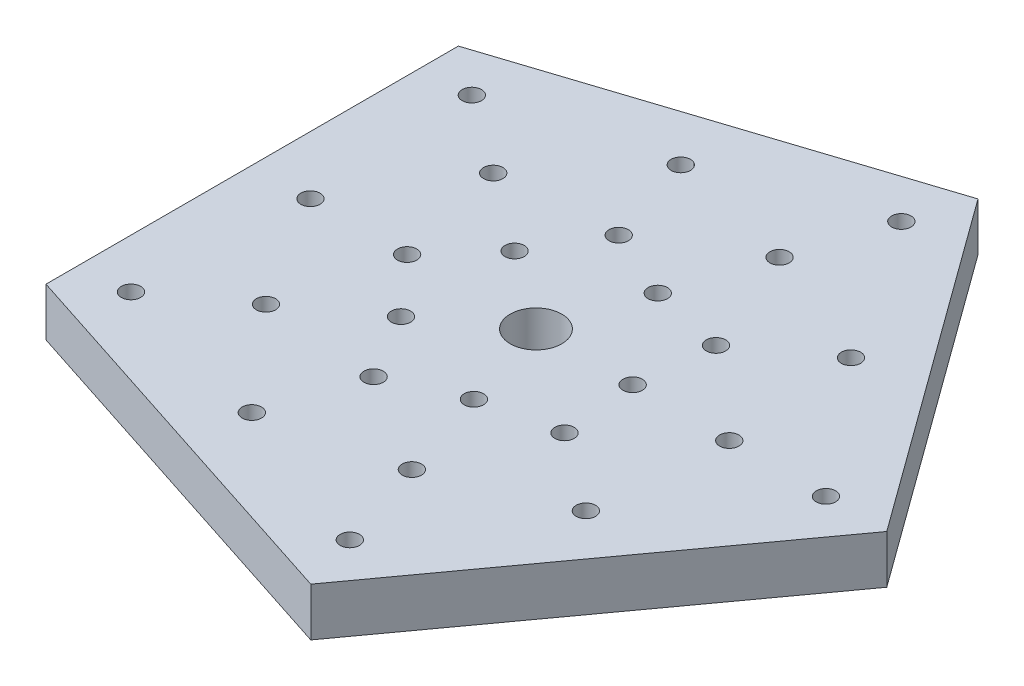
ISO-10303-21;
HEADER;
FILE_DESCRIPTION(('STEP AP214'),'2;1');
FILE_NAME('part.step','',(''),(''),'','','');
FILE_SCHEMA(('AUTOMOTIVE_DESIGN { 1 0 10303 214 1 1 1 1 }'));
ENDSEC;
DATA;
#1=APPLICATION_CONTEXT('core data for automotive mechanical design processes');
#2=APPLICATION_PROTOCOL_DEFINITION('international standard','automotive_design',2000,#1);
#3=PRODUCT_CONTEXT('',#1,'mechanical');
#4=PRODUCT('Part','Part','',(#3));
#5=PRODUCT_RELATED_PRODUCT_CATEGORY('part','',(#4));
#6=PRODUCT_DEFINITION_FORMATION('','',#4);
#7=PRODUCT_DEFINITION_CONTEXT('part definition',#1,'design');
#8=PRODUCT_DEFINITION('design','',#6,#7);
#9=PRODUCT_DEFINITION_SHAPE('','',#8);
#10=(LENGTH_UNIT() NAMED_UNIT(*) SI_UNIT(.MILLI.,.METRE.));
#11=(NAMED_UNIT(*) PLANE_ANGLE_UNIT() SI_UNIT($,.RADIAN.));
#12=(NAMED_UNIT(*) SI_UNIT($,.STERADIAN.) SOLID_ANGLE_UNIT());
#13=UNCERTAINTY_MEASURE_WITH_UNIT(LENGTH_MEASURE(1.E-05),#10,'distance_accuracy_value','');
#14=(GEOMETRIC_REPRESENTATION_CONTEXT(3) GLOBAL_UNCERTAINTY_ASSIGNED_CONTEXT((#13)) GLOBAL_UNIT_ASSIGNED_CONTEXT((#10,
#11,#12)) REPRESENTATION_CONTEXT('',''));
#15=CARTESIAN_POINT('',(0.,0.,0.));
#16=DIRECTION('',(0.,0.,1.));
#17=DIRECTION('',(1.,0.,0.));
#18=AXIS2_PLACEMENT_3D('',#15,#16,#17);
#19=CARTESIAN_POINT('',(16.8233955878123,7.5,51.7770876399966));
#20=DIRECTION('',(-0.809016994374947,0.,-0.587785252292473));
#21=DIRECTION('',(-0.587785252292473,0.,0.809016994374948));
#22=AXIS2_PLACEMENT_3D('',#19,#20,#21);
#23=PLANE('',#22);
#24=DIRECTION('',(0.587785252292473,0.,-0.809016994374948));
#25=VECTOR('',#24,1.);
#26=CARTESIAN_POINT('',(16.8233955878123,0.,51.7770876399966));
#27=LINE('',#26,#25);
#28=CARTESIAN_POINT('',(16.8233955878123,0.,51.7770876399966));
#29=VERTEX_POINT('',#28);
#30=CARTESIAN_POINT('',(54.4416517345306,0.,0.));
#31=VERTEX_POINT('',#30);
#32=EDGE_CURVE('E109',#29,#31,#27,.T.);
#33=ORIENTED_EDGE('',*,*,#32,.T.);
#34=DIRECTION('',(0.,-1.,0.));
#35=VECTOR('',#34,1.);
#36=CARTESIAN_POINT('',(54.4416517345306,7.5,0.));
#37=LINE('',#36,#35);
#38=CARTESIAN_POINT('',(54.4416517345306,7.5,0.));
#39=VERTEX_POINT('',#38);
#40=EDGE_CURVE('E11',#39,#31,#37,.T.);
#41=ORIENTED_EDGE('',*,*,#40,.F.);
#42=DIRECTION('',(0.587785252292473,0.,-0.809016994374948));
#43=VECTOR('',#42,1.);
#44=CARTESIAN_POINT('',(16.8233955878123,7.5,51.7770876399966));
#45=LINE('',#44,#43);
#46=CARTESIAN_POINT('',(16.8233955878123,7.5,51.7770876399966));
#47=VERTEX_POINT('',#46);
#48=EDGE_CURVE('E118',#47,#39,#45,.T.);
#49=ORIENTED_EDGE('',*,*,#48,.F.);
#50=DIRECTION('',(0.,-1.,0.));
#51=VECTOR('',#50,1.);
#52=CARTESIAN_POINT('',(16.8233955878123,7.5,51.7770876399966));
#53=LINE('',#52,#51);
#54=EDGE_CURVE('E105',#47,#29,#53,.T.);
#55=ORIENTED_EDGE('',*,*,#54,.T.);
#56=EDGE_LOOP('',(#33,#41,#49,#55));
#57=FACE_BOUND('',#56,.T.);
#58=ADVANCED_FACE('F35',(#57),#23,.F.);
#59=CARTESIAN_POINT('',(54.4416517345306,7.5,0.));
#60=DIRECTION('',(-0.809016994374947,0.,0.587785252292473));
#61=DIRECTION('',(0.587785252292473,0.,0.809016994374947));
#62=AXIS2_PLACEMENT_3D('',#59,#60,#61);
#63=PLANE('',#62);
#64=DIRECTION('',(-0.587785252292473,0.,-0.809016994374947));
#65=VECTOR('',#64,1.);
#66=CARTESIAN_POINT('',(54.4416517345306,0.,0.));
#67=LINE('',#66,#65);
#68=CARTESIAN_POINT('',(16.8233955878123,0.,-51.7770876399967));
#69=VERTEX_POINT('',#68);
#70=EDGE_CURVE('E112',#31,#69,#67,.T.);
#71=ORIENTED_EDGE('',*,*,#70,.T.);
#72=DIRECTION('',(0.,-1.,0.));
#73=VECTOR('',#72,1.);
#74=CARTESIAN_POINT('',(16.8233955878123,7.5,-51.7770876399967));
#75=LINE('',#74,#73);
#76=CARTESIAN_POINT('',(16.8233955878123,7.5,-51.7770876399967));
#77=VERTEX_POINT('',#76);
#78=EDGE_CURVE('E43',#77,#69,#75,.T.);
#79=ORIENTED_EDGE('',*,*,#78,.F.);
#80=DIRECTION('',(-0.587785252292473,0.,-0.809016994374947));
#81=VECTOR('',#80,1.);
#82=CARTESIAN_POINT('',(54.4416517345306,7.5,0.));
#83=LINE('',#82,#81);
#84=EDGE_CURVE('E85',#39,#77,#83,.T.);
#85=ORIENTED_EDGE('',*,*,#84,.F.);
#86=ORIENTED_EDGE('',*,*,#40,.T.);
#87=EDGE_LOOP('',(#71,#79,#85,#86));
#88=FACE_BOUND('',#87,.T.);
#89=ADVANCED_FACE('F138',(#88),#63,.F.);
#90=CARTESIAN_POINT('',(16.8233955878123,7.5,-51.7770876399967));
#91=DIRECTION('',(0.309016994374948,0.,0.951056516295154));
#92=DIRECTION('',(0.951056516295154,0.,-0.309016994374948));
#93=AXIS2_PLACEMENT_3D('',#90,#91,#92);
#94=PLANE('',#93);
#95=DIRECTION('',(-0.951056516295154,0.,0.309016994374948));
#96=VECTOR('',#95,1.);
#97=CARTESIAN_POINT('',(16.8233955878123,0.,-51.7770876399967));
#98=LINE('',#97,#96);
#99=CARTESIAN_POINT('',(-44.0442214550775,0.,-32.));
#100=VERTEX_POINT('',#99);
#101=EDGE_CURVE('E100',#69,#100,#98,.T.);
#102=ORIENTED_EDGE('',*,*,#101,.T.);
#103=DIRECTION('',(0.,-1.,0.));
#104=VECTOR('',#103,1.);
#105=CARTESIAN_POINT('',(-44.0442214550775,7.5,-32.));
#106=LINE('',#105,#104);
#107=CARTESIAN_POINT('',(-44.0442214550775,7.5,-32.));
#108=VERTEX_POINT('',#107);
#109=EDGE_CURVE('E97',#108,#100,#106,.T.);
#110=ORIENTED_EDGE('',*,*,#109,.F.);
#111=DIRECTION('',(-0.951056516295154,0.,0.309016994374948));
#112=VECTOR('',#111,1.);
#113=CARTESIAN_POINT('',(16.8233955878123,7.5,-51.7770876399967));
#114=LINE('',#113,#112);
#115=EDGE_CURVE('E89',#77,#108,#114,.T.);
#116=ORIENTED_EDGE('',*,*,#115,.F.);
#117=ORIENTED_EDGE('',*,*,#78,.T.);
#118=EDGE_LOOP('',(#102,#110,#116,#117));
#119=FACE_BOUND('',#118,.T.);
#120=ADVANCED_FACE('F98',(#119),#94,.F.);
#121=CARTESIAN_POINT('',(-44.0442214550775,7.5,-32.));
#122=DIRECTION('',(1.,0.,0.));
#123=DIRECTION('',(0.,0.,-1.));
#124=AXIS2_PLACEMENT_3D('',#121,#122,#123);
#125=PLANE('',#124);
#126=DIRECTION('',(0.,0.,1.));
#127=VECTOR('',#126,1.);
#128=CARTESIAN_POINT('',(-44.0442214550775,0.,-32.));
#129=LINE('',#128,#127);
#130=CARTESIAN_POINT('',(-44.0442214550775,0.,32.));
#131=VERTEX_POINT('',#130);
#132=EDGE_CURVE('E71',#100,#131,#129,.T.);
#133=ORIENTED_EDGE('',*,*,#132,.T.);
#134=DIRECTION('',(0.,-1.,0.));
#135=VECTOR('',#134,1.);
#136=CARTESIAN_POINT('',(-44.0442214550775,7.5,32.));
#137=LINE('',#136,#135);
#138=CARTESIAN_POINT('',(-44.0442214550775,7.5,32.));
#139=VERTEX_POINT('',#138);
#140=EDGE_CURVE('E101',#139,#131,#137,.T.);
#141=ORIENTED_EDGE('',*,*,#140,.F.);
#142=DIRECTION('',(0.,0.,1.));
#143=VECTOR('',#142,1.);
#144=CARTESIAN_POINT('',(-44.0442214550775,7.5,-32.));
#145=LINE('',#144,#143);
#146=EDGE_CURVE('E93',#108,#139,#145,.T.);
#147=ORIENTED_EDGE('',*,*,#146,.F.);
#148=ORIENTED_EDGE('',*,*,#109,.T.);
#149=EDGE_LOOP('',(#133,#141,#147,#148));
#150=FACE_BOUND('',#149,.T.);
#151=ADVANCED_FACE('F103',(#150),#125,.F.);
#152=CARTESIAN_POINT('',(-44.0442214550775,7.5,32.));
#153=DIRECTION('',(0.309016994374948,0.,-0.951056516295154));
#154=DIRECTION('',(-0.951056516295154,0.,-0.309016994374948));
#155=AXIS2_PLACEMENT_3D('',#152,#153,#154);
#156=PLANE('',#155);
#157=DIRECTION('',(0.951056516295154,0.,0.309016994374948));
#158=VECTOR('',#157,1.);
#159=CARTESIAN_POINT('',(-44.0442214550775,0.,32.));
#160=LINE('',#159,#158);
#161=EDGE_CURVE('E77',#131,#29,#160,.T.);
#162=ORIENTED_EDGE('',*,*,#161,.T.);
#163=ORIENTED_EDGE('',*,*,#54,.F.);
#164=DIRECTION('',(0.951056516295154,0.,0.309016994374948));
#165=VECTOR('',#164,1.);
#166=CARTESIAN_POINT('',(-44.0442214550775,7.5,32.));
#167=LINE('',#166,#165);
#168=EDGE_CURVE('E51',#139,#47,#167,.T.);
#169=ORIENTED_EDGE('',*,*,#168,.F.);
#170=ORIENTED_EDGE('',*,*,#140,.T.);
#171=EDGE_LOOP('',(#162,#163,#169,#170));
#172=FACE_BOUND('',#171,.T.);
#173=ADVANCED_FACE('F126',(#172),#156,.F.);
#174=CARTESIAN_POINT('',(0.,7.5,0.));
#175=DIRECTION('',(0.,1.,0.));
#176=DIRECTION('',(0.,0.,1.));
#177=AXIS2_PLACEMENT_3D('',#174,#175,#176);
#178=PLANE('',#177);
#179=CARTESIAN_POINT('',(15.,7.5,-1.75207071073658E-13));
#180=DIRECTION('',(0.,1.,0.));
#181=DIRECTION('',(-0.95105651629515,0.,0.309016994374958));
#182=AXIS2_PLACEMENT_3D('',#179,#180,#181);
#183=CIRCLE('',#182,1.5);
#184=CARTESIAN_POINT('',(13.5734152255573,7.5,0.463525491562262));
#185=VERTEX_POINT('',#184);
#186=EDGE_CURVE('E442',#185,#185,#183,.T.);
#187=ORIENTED_EDGE('',*,*,#186,.F.);
#188=EDGE_LOOP('',(#187));
#189=FACE_BOUND('',#188,.T.);
#190=CARTESIAN_POINT('',(30.,7.5,-3.46944695195361E-13));
#191=DIRECTION('',(0.,1.,0.));
#192=DIRECTION('',(-0.95105651629515,0.,0.309016994374958));
#193=AXIS2_PLACEMENT_3D('',#190,#191,#192);
#194=CIRCLE('',#193,1.5);
#195=CARTESIAN_POINT('',(28.5734152255573,7.5,0.463525491562091));
#196=VERTEX_POINT('',#195);
#197=EDGE_CURVE('E448',#196,#196,#194,.T.);
#198=ORIENTED_EDGE('',*,*,#197,.F.);
#199=EDGE_LOOP('',(#198));
#200=FACE_BOUND('',#199,.T.);
#201=CARTESIAN_POINT('',(45.,7.5,-5.20417042793042E-13));
#202=DIRECTION('',(0.,1.,0.));
#203=DIRECTION('',(-0.95105651629515,0.,0.309016994374958));
#204=AXIS2_PLACEMENT_3D('',#201,#202,#203);
#205=CIRCLE('',#204,1.5);
#206=CARTESIAN_POINT('',(43.5734152255573,7.5,0.463525491561918));
#207=VERTEX_POINT('',#206);
#208=EDGE_CURVE('E709',#207,#207,#205,.T.);
#209=ORIENTED_EDGE('',*,*,#208,.F.);
#210=EDGE_LOOP('',(#209));
#211=FACE_BOUND('',#210,.T.);
#212=CARTESIAN_POINT('',(-35.,7.5,4.02455846426619E-13));
#213=DIRECTION('',(0.,1.,0.));
#214=DIRECTION('',(-0.95105651629515,0.,0.309016994374958));
#215=AXIS2_PLACEMENT_3D('',#212,#213,#214);
#216=CIRCLE('',#215,1.5);
#217=CARTESIAN_POINT('',(-36.4265847744427,7.5,0.463525491562841));
#218=VERTEX_POINT('',#217);
#219=EDGE_CURVE('E445',#218,#218,#216,.T.);
#220=ORIENTED_EDGE('',*,*,#219,.F.);
#221=EDGE_LOOP('',(#220));
#222=FACE_BOUND('',#221,.T.);
#223=CARTESIAN_POINT('',(-20.,7.5,2.28983498828939E-13));
#224=DIRECTION('',(0.,1.,0.));
#225=DIRECTION('',(-0.95105651629515,0.,0.309016994374958));
#226=AXIS2_PLACEMENT_3D('',#223,#224,#225);
#227=CIRCLE('',#226,1.5);
#228=CARTESIAN_POINT('',(-21.4265847744427,7.5,0.463525491562667));
#229=VERTEX_POINT('',#228);
#230=EDGE_CURVE('E465',#229,#229,#227,.T.);
#231=ORIENTED_EDGE('',*,*,#230,.F.);
#232=EDGE_LOOP('',(#231));
#233=FACE_BOUND('',#232,.T.);
#234=CARTESIAN_POINT('',(13.905764746873,7.5,42.7975432332818));
#235=DIRECTION('',(0.,1.,0.));
#236=DIRECTION('',(-0.58778525229248,0.,-0.809016994374942));
#237=AXIS2_PLACEMENT_3D('',#234,#235,#236);
#238=CIRCLE('',#237,1.5);
#239=CARTESIAN_POINT('',(13.0240868684343,7.5,41.5840177417194));
#240=VERTEX_POINT('',#239);
#241=EDGE_CURVE('E459',#240,#240,#238,.T.);
#242=ORIENTED_EDGE('',*,*,#241,.F.);
#243=EDGE_LOOP('',(#242));
#244=FACE_BOUND('',#243,.T.);
#245=CARTESIAN_POINT('',(28.3155948031231,7.5,-20.5724838302367));
#246=DIRECTION('',(0.,1.,0.));
#247=DIRECTION('',(0.587785252292469,0.,-0.809016994374951));
#248=AXIS2_PLACEMENT_3D('',#245,#246,#247);
#249=CIRCLE('',#248,1.5);
#250=CARTESIAN_POINT('',(29.1972726815618,7.5,-21.7860093217992));
#251=VERTEX_POINT('',#250);
#252=EDGE_CURVE('E506',#251,#251,#249,.T.);
#253=ORIENTED_EDGE('',*,*,#252,.F.);
#254=EDGE_LOOP('',(#253));
#255=FACE_BOUND('',#254,.T.);
#256=CARTESIAN_POINT('',(16.1803398874989,7.5,-11.7557050458496));
#257=DIRECTION('',(0.,1.,0.));
#258=DIRECTION('',(0.587785252292469,0.,-0.809016994374951));
#259=AXIS2_PLACEMENT_3D('',#256,#257,#258);
#260=CIRCLE('',#259,1.5);
#261=CARTESIAN_POINT('',(17.0620177659376,7.5,-12.969230537412));
#262=VERTEX_POINT('',#261);
#263=EDGE_CURVE('E525',#262,#262,#260,.T.);
#264=ORIENTED_EDGE('',*,*,#263,.F.);
#265=EDGE_LOOP('',(#264));
#266=FACE_BOUND('',#265,.T.);
#267=CARTESIAN_POINT('',(-36.4057647468727,7.5,-26.4503363531612));
#268=DIRECTION('',(0.,1.,0.));
#269=DIRECTION('',(0.951056516295155,0.,0.309016994374945));
#270=AXIS2_PLACEMENT_3D('',#267,#268,#269);
#271=CIRCLE('',#270,1.5);
#272=CARTESIAN_POINT('',(-34.97917997243,7.5,-25.9868108615988));
#273=VERTEX_POINT('',#272);
#274=EDGE_CURVE('E519',#273,#273,#271,.T.);
#275=ORIENTED_EDGE('',*,*,#274,.F.);
#276=EDGE_LOOP('',(#275));
#277=FACE_BOUND('',#276,.T.);
#278=CARTESIAN_POINT('',(-24.2705098312485,7.5,-17.6335575687741));
#279=DIRECTION('',(0.,1.,0.));
#280=DIRECTION('',(0.951056516295155,0.,0.309016994374945));
#281=AXIS2_PLACEMENT_3D('',#278,#279,#280);
#282=CIRCLE('',#281,1.5);
#283=CARTESIAN_POINT('',(-22.8439250568057,7.5,-17.1700320772117));
#284=VERTEX_POINT('',#283);
#285=EDGE_CURVE('E518',#284,#284,#282,.T.);
#286=ORIENTED_EDGE('',*,*,#285,.F.);
#287=EDGE_LOOP('',(#286));
#288=FACE_BOUND('',#287,.T.);
#289=CARTESIAN_POINT('',(-12.1352549156242,7.5,-8.81677878438706));
#290=DIRECTION('',(0.,1.,0.));
#291=DIRECTION('',(0.951056516295155,0.,0.309016994374945));
#292=AXIS2_PLACEMENT_3D('',#289,#290,#291);
#293=CIRCLE('',#292,1.5);
#294=CARTESIAN_POINT('',(-10.7086701411815,7.5,-8.35325329282464));
#295=VERTEX_POINT('',#294);
#296=EDGE_CURVE('E549',#295,#295,#293,.T.);
#297=ORIENTED_EDGE('',*,*,#296,.F.);
#298=EDGE_LOOP('',(#297));
#299=FACE_BOUND('',#298,.T.);
#300=CARTESIAN_POINT('',(28.3155948031232,7.5,20.5724838302365));
#301=DIRECTION('',(0.,1.,0.));
#302=DIRECTION('',(0.951056516295155,0.,0.309016994374945));
#303=AXIS2_PLACEMENT_3D('',#300,#301,#302);
#304=CIRCLE('',#303,1.5);
#305=CARTESIAN_POINT('',(29.742179577566,7.5,21.0360093217989));
#306=VERTEX_POINT('',#305);
#307=EDGE_CURVE('E543',#306,#306,#304,.T.);
#308=ORIENTED_EDGE('',*,*,#307,.F.);
#309=EDGE_LOOP('',(#308));
#310=FACE_BOUND('',#309,.T.);
#311=CARTESIAN_POINT('',(16.180339887499,7.5,11.7557050458494));
#312=DIRECTION('',(0.,1.,0.));
#313=DIRECTION('',(0.951056516295155,0.,0.309016994374945));
#314=AXIS2_PLACEMENT_3D('',#311,#312,#313);
#315=CIRCLE('',#314,1.5);
#316=CARTESIAN_POINT('',(17.6069246619417,7.5,12.2192305374118));
#317=VERTEX_POINT('',#316);
#318=EDGE_CURVE('E537',#317,#317,#315,.T.);
#319=ORIENTED_EDGE('',*,*,#318,.F.);
#320=EDGE_LOOP('',(#319));
#321=FACE_BOUND('',#320,.T.);
#322=CARTESIAN_POINT('',(9.27050983124868,7.5,28.5316954888545));
#323=DIRECTION('',(0.,1.,0.));
#324=DIRECTION('',(-0.58778525229248,0.,-0.809016994374942));
#325=AXIS2_PLACEMENT_3D('',#322,#323,#324);
#326=CIRCLE('',#325,1.5);
#327=CARTESIAN_POINT('',(8.38883195280996,7.5,27.3181699972921));
#328=VERTEX_POINT('',#327);
#329=EDGE_CURVE('E458',#328,#328,#326,.T.);
#330=ORIENTED_EDGE('',*,*,#329,.F.);
#331=EDGE_LOOP('',(#330));
#332=FACE_BOUND('',#331,.T.);
#333=CARTESIAN_POINT('',(4.63525491562434,7.5,14.2658477444273));
#334=DIRECTION('',(0.,1.,0.));
#335=DIRECTION('',(-0.58778525229248,0.,-0.809016994374942));
#336=AXIS2_PLACEMENT_3D('',#333,#334,#335);
#337=CIRCLE('',#336,1.5);
#338=CARTESIAN_POINT('',(3.75357703718562,7.5,13.0523222528648));
#339=VERTEX_POINT('',#338);
#340=EDGE_CURVE('E489',#339,#339,#337,.T.);
#341=ORIENTED_EDGE('',*,*,#340,.F.);
#342=EDGE_LOOP('',(#341));
#343=FACE_BOUND('',#342,.T.);
#344=CARTESIAN_POINT('',(-10.8155948031235,7.5,-33.2869780703303));
#345=DIRECTION('',(0.,1.,0.));
#346=DIRECTION('',(-0.58778525229248,0.,-0.809016994374942));
#347=AXIS2_PLACEMENT_3D('',#344,#345,#346);
#348=CIRCLE('',#347,1.5);
#349=CARTESIAN_POINT('',(-11.6972726815622,7.5,-34.5005035618927));
#350=VERTEX_POINT('',#349);
#351=EDGE_CURVE('E483',#350,#350,#348,.T.);
#352=ORIENTED_EDGE('',*,*,#351,.F.);
#353=EDGE_LOOP('',(#352));
#354=FACE_BOUND('',#353,.T.);
#355=CARTESIAN_POINT('',(-6.18033988749912,7.5,-19.021130325903));
#356=DIRECTION('',(0.,1.,0.));
#357=DIRECTION('',(-0.58778525229248,0.,-0.809016994374942));
#358=AXIS2_PLACEMENT_3D('',#355,#356,#357);
#359=CIRCLE('',#358,1.5);
#360=CARTESIAN_POINT('',(-7.06201776593784,7.5,-20.2346558174654));
#361=VERTEX_POINT('',#360);
#362=EDGE_CURVE('E477',#361,#361,#359,.T.);
#363=ORIENTED_EDGE('',*,*,#362,.F.);
#364=EDGE_LOOP('',(#363));
#365=FACE_BOUND('',#364,.T.);
#366=CARTESIAN_POINT('',(-12.1352549156242,7.5,8.81677878438717));
#367=DIRECTION('',(0.,1.,0.));
#368=DIRECTION('',(0.587785252292469,0.,-0.809016994374951));
#369=AXIS2_PLACEMENT_3D('',#366,#367,#368);
#370=CIRCLE('',#369,1.5);
#371=CARTESIAN_POINT('',(-11.2535770371855,7.5,7.60325329282474));
#372=VERTEX_POINT('',#371);
#373=EDGE_CURVE('E507',#372,#372,#370,.T.);
#374=ORIENTED_EDGE('',*,*,#373,.F.);
#375=EDGE_LOOP('',(#374));
#376=FACE_BOUND('',#375,.T.);
#377=CARTESIAN_POINT('',(-24.2705098312483,7.5,17.6335575687743));
#378=DIRECTION('',(0.,1.,0.));
#379=DIRECTION('',(0.587785252292469,0.,-0.809016994374951));
#380=AXIS2_PLACEMENT_3D('',#377,#378,#379);
#381=CIRCLE('',#380,1.5);
#382=CARTESIAN_POINT('',(-23.3888319528096,7.5,16.4200320772119));
#383=VERTEX_POINT('',#382);
#384=EDGE_CURVE('E500',#383,#383,#381,.T.);
#385=ORIENTED_EDGE('',*,*,#384,.F.);
#386=EDGE_LOOP('',(#385));
#387=FACE_BOUND('',#386,.T.);
#388=CARTESIAN_POINT('',(-36.4057647468725,7.5,26.4503363531615));
#389=DIRECTION('',(0.,1.,0.));
#390=DIRECTION('',(0.587785252292469,0.,-0.809016994374951));
#391=AXIS2_PLACEMENT_3D('',#388,#389,#390);
#392=CIRCLE('',#391,1.5);
#393=CARTESIAN_POINT('',(-35.5240868684338,7.5,25.2368108615991));
#394=VERTEX_POINT('',#393);
#395=EDGE_CURVE('E476',#394,#394,#392,.T.);
#396=ORIENTED_EDGE('',*,*,#395,.F.);
#397=EDGE_LOOP('',(#396));
#398=FACE_BOUND('',#397,.T.);
#399=CARTESIAN_POINT('',(13.9057647468726,7.5,-42.7975432332819));
#400=DIRECTION('',(0.,1.,0.));
#401=DIRECTION('',(0.,0.,1.));
#402=AXIS2_PLACEMENT_3D('',#399,#400,#401);
#403=CIRCLE('',#402,1.5);
#404=CARTESIAN_POINT('',(13.9057647468726,7.5,-41.2975432332819));
#405=VERTEX_POINT('',#404);
#406=EDGE_CURVE('E536',#405,#405,#403,.T.);
#407=ORIENTED_EDGE('',*,*,#406,.F.);
#408=EDGE_LOOP('',(#407));
#409=FACE_BOUND('',#408,.T.);
#410=CARTESIAN_POINT('',(9.27050983124841,7.5,-28.5316954888546));
#411=DIRECTION('',(0.,1.,0.));
#412=DIRECTION('',(0.,0.,1.));
#413=AXIS2_PLACEMENT_3D('',#410,#411,#412);
#414=CIRCLE('',#413,1.5);
#415=CARTESIAN_POINT('',(9.27050983124841,7.5,-27.0316954888546));
#416=VERTEX_POINT('',#415);
#417=EDGE_CURVE('E579',#416,#416,#414,.T.);
#418=ORIENTED_EDGE('',*,*,#417,.F.);
#419=EDGE_LOOP('',(#418));
#420=FACE_BOUND('',#419,.T.);
#421=CARTESIAN_POINT('',(4.6352549156242,7.5,-14.2658477444273));
#422=DIRECTION('',(0.,1.,0.));
#423=DIRECTION('',(0.,0.,1.));
#424=AXIS2_PLACEMENT_3D('',#421,#422,#423);
#425=CIRCLE('',#424,1.5);
#426=CARTESIAN_POINT('',(4.6352549156242,7.5,-12.7658477444273));
#427=VERTEX_POINT('',#426);
#428=EDGE_CURVE('E573',#427,#427,#425,.T.);
#429=ORIENTED_EDGE('',*,*,#428,.F.);
#430=EDGE_LOOP('',(#429));
#431=FACE_BOUND('',#430,.T.);
#432=CARTESIAN_POINT('',(-10.8155948031232,7.5,33.2869780703304));
#433=DIRECTION('',(0.,1.,0.));
#434=DIRECTION('',(0.,0.,1.));
#435=AXIS2_PLACEMENT_3D('',#432,#433,#434);
#436=CIRCLE('',#435,1.5);
#437=CARTESIAN_POINT('',(-10.8155948031232,7.5,34.7869780703304));
#438=VERTEX_POINT('',#437);
#439=EDGE_CURVE('E567',#438,#438,#436,.T.);
#440=ORIENTED_EDGE('',*,*,#439,.F.);
#441=EDGE_LOOP('',(#440));
#442=FACE_BOUND('',#441,.T.);
#443=CARTESIAN_POINT('',(-6.18033988749895,7.5,19.0211303259031));
#444=DIRECTION('',(0.,1.,0.));
#445=DIRECTION('',(0.,0.,1.));
#446=AXIS2_PLACEMENT_3D('',#443,#444,#445);
#447=CIRCLE('',#446,1.5);
#448=CARTESIAN_POINT('',(-6.18033988749895,7.5,20.5211303259031));
#449=VERTEX_POINT('',#448);
#450=EDGE_CURVE('E561',#449,#449,#447,.T.);
#451=ORIENTED_EDGE('',*,*,#450,.F.);
#452=EDGE_LOOP('',(#451));
#453=FACE_BOUND('',#452,.T.);
#454=CARTESIAN_POINT('',(0.,7.5,0.));
#455=DIRECTION('',(0.,1.,0.));
#456=DIRECTION('',(0.,0.,1.));
#457=AXIS2_PLACEMENT_3D('',#454,#455,#456);
#458=CIRCLE('',#457,4.);
#459=CARTESIAN_POINT('',(0.,7.5,4.00000000000001));
#460=VERTEX_POINT('',#459);
#461=EDGE_CURVE('E560',#460,#460,#458,.T.);
#462=ORIENTED_EDGE('',*,*,#461,.F.);
#463=EDGE_LOOP('',(#462));
#464=FACE_BOUND('',#463,.T.);
#465=ORIENTED_EDGE('',*,*,#48,.T.);
#466=ORIENTED_EDGE('',*,*,#84,.T.);
#467=ORIENTED_EDGE('',*,*,#115,.T.);
#468=ORIENTED_EDGE('',*,*,#146,.T.);
#469=ORIENTED_EDGE('',*,*,#168,.T.);
#470=EDGE_LOOP('',(#465,#466,#467,#468,#469));
#471=FACE_BOUND('',#470,.T.);
#472=ADVANCED_FACE('F91',(#189,#200,#211,#222,#233,#244,#255,#266,#277,#288,#299,#310,#321,#332,
#343,#354,#365,#376,#387,#398,#409,#420,#431,#442,#453,#464,#471),#178,.T.);
#473=CARTESIAN_POINT('',(0.,0.,0.));
#474=DIRECTION('',(0.,1.,0.));
#475=DIRECTION('',(0.,0.,1.));
#476=AXIS2_PLACEMENT_3D('',#473,#474,#475);
#477=PLANE('',#476);
#478=CARTESIAN_POINT('',(15.,0.,-1.75207071073658E-13));
#479=DIRECTION('',(0.,1.,0.));
#480=DIRECTION('',(-0.95105651629515,0.,0.309016994374958));
#481=AXIS2_PLACEMENT_3D('',#478,#479,#480);
#482=CIRCLE('',#481,1.5);
#483=CARTESIAN_POINT('',(13.5734152255573,0.,0.463525491562262));
#484=VERTEX_POINT('',#483);
#485=EDGE_CURVE('E439',#484,#484,#482,.T.);
#486=ORIENTED_EDGE('',*,*,#485,.T.);
#487=EDGE_LOOP('',(#486));
#488=FACE_BOUND('',#487,.T.);
#489=CARTESIAN_POINT('',(30.,0.,-3.46944695195361E-13));
#490=DIRECTION('',(0.,1.,0.));
#491=DIRECTION('',(-0.95105651629515,0.,0.309016994374958));
#492=AXIS2_PLACEMENT_3D('',#489,#490,#491);
#493=CIRCLE('',#492,1.5);
#494=CARTESIAN_POINT('',(28.5734152255573,0.,0.463525491562091));
#495=VERTEX_POINT('',#494);
#496=EDGE_CURVE('E443',#495,#495,#493,.T.);
#497=ORIENTED_EDGE('',*,*,#496,.T.);
#498=EDGE_LOOP('',(#497));
#499=FACE_BOUND('',#498,.T.);
#500=CARTESIAN_POINT('',(45.,0.,-5.20417042793042E-13));
#501=DIRECTION('',(0.,1.,0.));
#502=DIRECTION('',(-0.95105651629515,0.,0.309016994374958));
#503=AXIS2_PLACEMENT_3D('',#500,#501,#502);
#504=CIRCLE('',#503,1.5);
#505=CARTESIAN_POINT('',(43.5734152255573,0.,0.463525491561918));
#506=VERTEX_POINT('',#505);
#507=EDGE_CURVE('E454',#506,#506,#504,.T.);
#508=ORIENTED_EDGE('',*,*,#507,.T.);
#509=EDGE_LOOP('',(#508));
#510=FACE_BOUND('',#509,.T.);
#511=CARTESIAN_POINT('',(-35.,0.,4.02455846426619E-13));
#512=DIRECTION('',(0.,1.,0.));
#513=DIRECTION('',(-0.95105651629515,0.,0.309016994374958));
#514=AXIS2_PLACEMENT_3D('',#511,#512,#513);
#515=CIRCLE('',#514,1.5);
#516=CARTESIAN_POINT('',(-36.4265847744427,0.,0.463525491562841));
#517=VERTEX_POINT('',#516);
#518=EDGE_CURVE('E468',#517,#517,#515,.T.);
#519=ORIENTED_EDGE('',*,*,#518,.T.);
#520=EDGE_LOOP('',(#519));
#521=FACE_BOUND('',#520,.T.);
#522=CARTESIAN_POINT('',(-20.,0.,2.28983498828939E-13));
#523=DIRECTION('',(0.,1.,0.));
#524=DIRECTION('',(-0.95105651629515,0.,0.309016994374958));
#525=AXIS2_PLACEMENT_3D('',#522,#523,#524);
#526=CIRCLE('',#525,1.5);
#527=CARTESIAN_POINT('',(-21.4265847744427,0.,0.463525491562667));
#528=VERTEX_POINT('',#527);
#529=EDGE_CURVE('E462',#528,#528,#526,.T.);
#530=ORIENTED_EDGE('',*,*,#529,.T.);
#531=EDGE_LOOP('',(#530));
#532=FACE_BOUND('',#531,.T.);
#533=CARTESIAN_POINT('',(13.905764746873,0.,42.7975432332818));
#534=DIRECTION('',(0.,1.,0.));
#535=DIRECTION('',(-0.58778525229248,0.,-0.809016994374942));
#536=AXIS2_PLACEMENT_3D('',#533,#534,#535);
#537=CIRCLE('',#536,1.5);
#538=CARTESIAN_POINT('',(13.0240868684343,0.,41.5840177417194));
#539=VERTEX_POINT('',#538);
#540=EDGE_CURVE('E455',#539,#539,#537,.T.);
#541=ORIENTED_EDGE('',*,*,#540,.T.);
#542=EDGE_LOOP('',(#541));
#543=FACE_BOUND('',#542,.T.);
#544=CARTESIAN_POINT('',(28.3155948031231,0.,-20.5724838302367));
#545=DIRECTION('',(0.,1.,0.));
#546=DIRECTION('',(0.587785252292469,0.,-0.809016994374951));
#547=AXIS2_PLACEMENT_3D('',#544,#545,#546);
#548=CIRCLE('',#547,1.5);
#549=CARTESIAN_POINT('',(29.1972726815618,0.,-21.7860093217992));
#550=VERTEX_POINT('',#549);
#551=EDGE_CURVE('E528',#550,#550,#548,.T.);
#552=ORIENTED_EDGE('',*,*,#551,.T.);
#553=EDGE_LOOP('',(#552));
#554=FACE_BOUND('',#553,.T.);
#555=CARTESIAN_POINT('',(16.1803398874989,0.,-11.7557050458496));
#556=DIRECTION('',(0.,1.,0.));
#557=DIRECTION('',(0.587785252292469,0.,-0.809016994374951));
#558=AXIS2_PLACEMENT_3D('',#555,#556,#557);
#559=CIRCLE('',#558,1.5);
#560=CARTESIAN_POINT('',(17.0620177659376,0.,-12.969230537412));
#561=VERTEX_POINT('',#560);
#562=EDGE_CURVE('E522',#561,#561,#559,.T.);
#563=ORIENTED_EDGE('',*,*,#562,.T.);
#564=EDGE_LOOP('',(#563));
#565=FACE_BOUND('',#564,.T.);
#566=CARTESIAN_POINT('',(-36.4057647468727,0.,-26.4503363531612));
#567=DIRECTION('',(0.,1.,0.));
#568=DIRECTION('',(0.951056516295155,0.,0.309016994374945));
#569=AXIS2_PLACEMENT_3D('',#566,#567,#568);
#570=CIRCLE('',#569,1.5);
#571=CARTESIAN_POINT('',(-34.97917997243,0.,-25.9868108615988));
#572=VERTEX_POINT('',#571);
#573=EDGE_CURVE('E515',#572,#572,#570,.T.);
#574=ORIENTED_EDGE('',*,*,#573,.T.);
#575=EDGE_LOOP('',(#574));
#576=FACE_BOUND('',#575,.T.);
#577=CARTESIAN_POINT('',(-24.2705098312485,0.,-17.6335575687741));
#578=DIRECTION('',(0.,1.,0.));
#579=DIRECTION('',(0.951056516295155,0.,0.309016994374945));
#580=AXIS2_PLACEMENT_3D('',#577,#578,#579);
#581=CIRCLE('',#580,1.5);
#582=CARTESIAN_POINT('',(-22.8439250568057,0.,-17.1700320772117));
#583=VERTEX_POINT('',#582);
#584=EDGE_CURVE('E552',#583,#583,#581,.T.);
#585=ORIENTED_EDGE('',*,*,#584,.T.);
#586=EDGE_LOOP('',(#585));
#587=FACE_BOUND('',#586,.T.);
#588=CARTESIAN_POINT('',(-12.1352549156242,0.,-8.81677878438706));
#589=DIRECTION('',(0.,1.,0.));
#590=DIRECTION('',(0.951056516295155,0.,0.309016994374945));
#591=AXIS2_PLACEMENT_3D('',#588,#589,#590);
#592=CIRCLE('',#591,1.5);
#593=CARTESIAN_POINT('',(-10.7086701411815,0.,-8.35325329282464));
#594=VERTEX_POINT('',#593);
#595=EDGE_CURVE('E546',#594,#594,#592,.T.);
#596=ORIENTED_EDGE('',*,*,#595,.T.);
#597=EDGE_LOOP('',(#596));
#598=FACE_BOUND('',#597,.T.);
#599=CARTESIAN_POINT('',(28.3155948031232,0.,20.5724838302365));
#600=DIRECTION('',(0.,1.,0.));
#601=DIRECTION('',(0.951056516295155,0.,0.309016994374945));
#602=AXIS2_PLACEMENT_3D('',#599,#600,#601);
#603=CIRCLE('',#602,1.5);
#604=CARTESIAN_POINT('',(29.742179577566,0.,21.0360093217989));
#605=VERTEX_POINT('',#604);
#606=EDGE_CURVE('E540',#605,#605,#603,.T.);
#607=ORIENTED_EDGE('',*,*,#606,.T.);
#608=EDGE_LOOP('',(#607));
#609=FACE_BOUND('',#608,.T.);
#610=CARTESIAN_POINT('',(16.180339887499,0.,11.7557050458494));
#611=DIRECTION('',(0.,1.,0.));
#612=DIRECTION('',(0.951056516295155,0.,0.309016994374945));
#613=AXIS2_PLACEMENT_3D('',#610,#611,#612);
#614=CIRCLE('',#613,1.5);
#615=CARTESIAN_POINT('',(17.6069246619417,0.,12.2192305374118));
#616=VERTEX_POINT('',#615);
#617=EDGE_CURVE('E533',#616,#616,#614,.T.);
#618=ORIENTED_EDGE('',*,*,#617,.T.);
#619=EDGE_LOOP('',(#618));
#620=FACE_BOUND('',#619,.T.);
#621=CARTESIAN_POINT('',(9.27050983124868,0.,28.5316954888545));
#622=DIRECTION('',(0.,1.,0.));
#623=DIRECTION('',(-0.58778525229248,0.,-0.809016994374942));
#624=AXIS2_PLACEMENT_3D('',#621,#622,#623);
#625=CIRCLE('',#624,1.5);
#626=CARTESIAN_POINT('',(8.38883195280996,0.,27.3181699972921));
#627=VERTEX_POINT('',#626);
#628=EDGE_CURVE('E492',#627,#627,#625,.T.);
#629=ORIENTED_EDGE('',*,*,#628,.T.);
#630=EDGE_LOOP('',(#629));
#631=FACE_BOUND('',#630,.T.);
#632=CARTESIAN_POINT('',(4.63525491562434,0.,14.2658477444273));
#633=DIRECTION('',(0.,1.,0.));
#634=DIRECTION('',(-0.58778525229248,0.,-0.809016994374942));
#635=AXIS2_PLACEMENT_3D('',#632,#633,#634);
#636=CIRCLE('',#635,1.5);
#637=CARTESIAN_POINT('',(3.75357703718562,0.,13.0523222528648));
#638=VERTEX_POINT('',#637);
#639=EDGE_CURVE('E486',#638,#638,#636,.T.);
#640=ORIENTED_EDGE('',*,*,#639,.T.);
#641=EDGE_LOOP('',(#640));
#642=FACE_BOUND('',#641,.T.);
#643=CARTESIAN_POINT('',(-10.8155948031235,0.,-33.2869780703303));
#644=DIRECTION('',(0.,1.,0.));
#645=DIRECTION('',(-0.58778525229248,0.,-0.809016994374942));
#646=AXIS2_PLACEMENT_3D('',#643,#644,#645);
#647=CIRCLE('',#646,1.5);
#648=CARTESIAN_POINT('',(-11.6972726815622,0.,-34.5005035618927));
#649=VERTEX_POINT('',#648);
#650=EDGE_CURVE('E480',#649,#649,#647,.T.);
#651=ORIENTED_EDGE('',*,*,#650,.T.);
#652=EDGE_LOOP('',(#651));
#653=FACE_BOUND('',#652,.T.);
#654=CARTESIAN_POINT('',(-6.18033988749912,0.,-19.021130325903));
#655=DIRECTION('',(0.,1.,0.));
#656=DIRECTION('',(-0.58778525229248,0.,-0.809016994374942));
#657=AXIS2_PLACEMENT_3D('',#654,#655,#656);
#658=CIRCLE('',#657,1.5);
#659=CARTESIAN_POINT('',(-7.06201776593784,0.,-20.2346558174654));
#660=VERTEX_POINT('',#659);
#661=EDGE_CURVE('E473',#660,#660,#658,.T.);
#662=ORIENTED_EDGE('',*,*,#661,.T.);
#663=EDGE_LOOP('',(#662));
#664=FACE_BOUND('',#663,.T.);
#665=CARTESIAN_POINT('',(-12.1352549156242,0.,8.81677878438717));
#666=DIRECTION('',(0.,1.,0.));
#667=DIRECTION('',(0.587785252292469,0.,-0.809016994374951));
#668=AXIS2_PLACEMENT_3D('',#665,#666,#667);
#669=CIRCLE('',#668,1.5);
#670=CARTESIAN_POINT('',(-11.2535770371855,0.,7.60325329282474));
#671=VERTEX_POINT('',#670);
#672=EDGE_CURVE('E503',#671,#671,#669,.T.);
#673=ORIENTED_EDGE('',*,*,#672,.T.);
#674=EDGE_LOOP('',(#673));
#675=FACE_BOUND('',#674,.T.);
#676=CARTESIAN_POINT('',(-24.2705098312483,0.,17.6335575687743));
#677=DIRECTION('',(0.,1.,0.));
#678=DIRECTION('',(0.587785252292469,0.,-0.809016994374951));
#679=AXIS2_PLACEMENT_3D('',#676,#677,#678);
#680=CIRCLE('',#679,1.5);
#681=CARTESIAN_POINT('',(-23.3888319528096,0.,16.4200320772119));
#682=VERTEX_POINT('',#681);
#683=EDGE_CURVE('E510',#682,#682,#680,.T.);
#684=ORIENTED_EDGE('',*,*,#683,.T.);
#685=EDGE_LOOP('',(#684));
#686=FACE_BOUND('',#685,.T.);
#687=CARTESIAN_POINT('',(-36.4057647468725,0.,26.4503363531615));
#688=DIRECTION('',(0.,1.,0.));
#689=DIRECTION('',(0.587785252292469,0.,-0.809016994374951));
#690=AXIS2_PLACEMENT_3D('',#687,#688,#689);
#691=CIRCLE('',#690,1.5);
#692=CARTESIAN_POINT('',(-35.5240868684338,0.,25.2368108615991));
#693=VERTEX_POINT('',#692);
#694=EDGE_CURVE('E497',#693,#693,#691,.T.);
#695=ORIENTED_EDGE('',*,*,#694,.T.);
#696=EDGE_LOOP('',(#695));
#697=FACE_BOUND('',#696,.T.);
#698=CARTESIAN_POINT('',(13.9057647468726,0.,-42.7975432332819));
#699=DIRECTION('',(0.,1.,0.));
#700=DIRECTION('',(0.,0.,1.));
#701=AXIS2_PLACEMENT_3D('',#698,#699,#700);
#702=CIRCLE('',#701,1.5);
#703=CARTESIAN_POINT('',(13.9057647468726,0.,-41.2975432332819));
#704=VERTEX_POINT('',#703);
#705=EDGE_CURVE('E582',#704,#704,#702,.T.);
#706=ORIENTED_EDGE('',*,*,#705,.T.);
#707=EDGE_LOOP('',(#706));
#708=FACE_BOUND('',#707,.T.);
#709=CARTESIAN_POINT('',(9.27050983124841,0.,-28.5316954888546));
#710=DIRECTION('',(0.,1.,0.));
#711=DIRECTION('',(0.,0.,1.));
#712=AXIS2_PLACEMENT_3D('',#709,#710,#711);
#713=CIRCLE('',#712,1.5);
#714=CARTESIAN_POINT('',(9.27050983124841,0.,-27.0316954888546));
#715=VERTEX_POINT('',#714);
#716=EDGE_CURVE('E576',#715,#715,#713,.T.);
#717=ORIENTED_EDGE('',*,*,#716,.T.);
#718=EDGE_LOOP('',(#717));
#719=FACE_BOUND('',#718,.T.);
#720=CARTESIAN_POINT('',(4.6352549156242,0.,-14.2658477444273));
#721=DIRECTION('',(0.,1.,0.));
#722=DIRECTION('',(0.,0.,1.));
#723=AXIS2_PLACEMENT_3D('',#720,#721,#722);
#724=CIRCLE('',#723,1.5);
#725=CARTESIAN_POINT('',(4.6352549156242,0.,-12.7658477444273));
#726=VERTEX_POINT('',#725);
#727=EDGE_CURVE('E570',#726,#726,#724,.T.);
#728=ORIENTED_EDGE('',*,*,#727,.T.);
#729=EDGE_LOOP('',(#728));
#730=FACE_BOUND('',#729,.T.);
#731=CARTESIAN_POINT('',(-10.8155948031232,0.,33.2869780703304));
#732=DIRECTION('',(0.,1.,0.));
#733=DIRECTION('',(0.,0.,1.));
#734=AXIS2_PLACEMENT_3D('',#731,#732,#733);
#735=CIRCLE('',#734,1.5);
#736=CARTESIAN_POINT('',(-10.8155948031232,0.,34.7869780703304));
#737=VERTEX_POINT('',#736);
#738=EDGE_CURVE('E564',#737,#737,#735,.T.);
#739=ORIENTED_EDGE('',*,*,#738,.T.);
#740=EDGE_LOOP('',(#739));
#741=FACE_BOUND('',#740,.T.);
#742=CARTESIAN_POINT('',(-6.18033988749895,0.,19.0211303259031));
#743=DIRECTION('',(0.,1.,0.));
#744=DIRECTION('',(0.,0.,1.));
#745=AXIS2_PLACEMENT_3D('',#742,#743,#744);
#746=CIRCLE('',#745,1.5);
#747=CARTESIAN_POINT('',(-6.18033988749895,0.,20.5211303259031));
#748=VERTEX_POINT('',#747);
#749=EDGE_CURVE('E557',#748,#748,#746,.T.);
#750=ORIENTED_EDGE('',*,*,#749,.T.);
#751=EDGE_LOOP('',(#750));
#752=FACE_BOUND('',#751,.T.);
#753=CARTESIAN_POINT('',(0.,0.,0.));
#754=DIRECTION('',(0.,1.,0.));
#755=DIRECTION('',(0.,0.,1.));
#756=AXIS2_PLACEMENT_3D('',#753,#754,#755);
#757=CIRCLE('',#756,4.);
#758=CARTESIAN_POINT('',(0.,0.,4.00000000000001));
#759=VERTEX_POINT('',#758);
#760=EDGE_CURVE('E113',#759,#759,#757,.T.);
#761=ORIENTED_EDGE('',*,*,#760,.T.);
#762=EDGE_LOOP('',(#761));
#763=FACE_BOUND('',#762,.T.);
#764=ORIENTED_EDGE('',*,*,#32,.F.);
#765=ORIENTED_EDGE('',*,*,#161,.F.);
#766=ORIENTED_EDGE('',*,*,#132,.F.);
#767=ORIENTED_EDGE('',*,*,#101,.F.);
#768=ORIENTED_EDGE('',*,*,#70,.F.);
#769=EDGE_LOOP('',(#764,#765,#766,#767,#768));
#770=FACE_BOUND('',#769,.T.);
#771=ADVANCED_FACE('F122',(#488,#499,#510,#521,#532,#543,#554,#565,#576,#587,#598,#609,#620,
#631,#642,#653,#664,#675,#686,#697,#708,#719,#730,#741,#752,#763,#770),#477,.F.);
#772=CARTESIAN_POINT('',(0.,0.,0.));
#773=DIRECTION('',(0.,1.,0.));
#774=DIRECTION('',(0.,0.,1.));
#775=AXIS2_PLACEMENT_3D('',#772,#773,#774);
#776=CYLINDRICAL_SURFACE('',#775,4.);
#777=ORIENTED_EDGE('',*,*,#760,.F.);
#778=EDGE_LOOP('',(#777));
#779=FACE_BOUND('',#778,.T.);
#780=ORIENTED_EDGE('',*,*,#461,.T.);
#781=EDGE_LOOP('',(#780));
#782=FACE_BOUND('',#781,.T.);
#783=ADVANCED_FACE('F174',(#779,#782),#776,.F.);
#784=CARTESIAN_POINT('',(-6.18033988749895,0.,19.0211303259031));
#785=DIRECTION('',(0.,1.,0.));
#786=DIRECTION('',(0.,0.,1.));
#787=AXIS2_PLACEMENT_3D('',#784,#785,#786);
#788=CYLINDRICAL_SURFACE('',#787,1.5);
#789=ORIENTED_EDGE('',*,*,#749,.F.);
#790=EDGE_LOOP('',(#789));
#791=FACE_BOUND('',#790,.T.);
#792=ORIENTED_EDGE('',*,*,#450,.T.);
#793=EDGE_LOOP('',(#792));
#794=FACE_BOUND('',#793,.T.);
#795=ADVANCED_FACE('F183',(#791,#794),#788,.F.);
#796=CARTESIAN_POINT('',(-10.8155948031232,0.,33.2869780703304));
#797=DIRECTION('',(0.,1.,0.));
#798=DIRECTION('',(0.,0.,1.));
#799=AXIS2_PLACEMENT_3D('',#796,#797,#798);
#800=CYLINDRICAL_SURFACE('',#799,1.5);
#801=ORIENTED_EDGE('',*,*,#738,.F.);
#802=EDGE_LOOP('',(#801));
#803=FACE_BOUND('',#802,.T.);
#804=ORIENTED_EDGE('',*,*,#439,.T.);
#805=EDGE_LOOP('',(#804));
#806=FACE_BOUND('',#805,.T.);
#807=ADVANCED_FACE('F192',(#803,#806),#800,.F.);
#808=CARTESIAN_POINT('',(4.6352549156242,0.,-14.2658477444273));
#809=DIRECTION('',(0.,1.,0.));
#810=DIRECTION('',(0.,0.,1.));
#811=AXIS2_PLACEMENT_3D('',#808,#809,#810);
#812=CYLINDRICAL_SURFACE('',#811,1.5);
#813=ORIENTED_EDGE('',*,*,#727,.F.);
#814=EDGE_LOOP('',(#813));
#815=FACE_BOUND('',#814,.T.);
#816=ORIENTED_EDGE('',*,*,#428,.T.);
#817=EDGE_LOOP('',(#816));
#818=FACE_BOUND('',#817,.T.);
#819=ADVANCED_FACE('F201',(#815,#818),#812,.F.);
#820=CARTESIAN_POINT('',(9.27050983124841,0.,-28.5316954888546));
#821=DIRECTION('',(0.,1.,0.));
#822=DIRECTION('',(0.,0.,1.));
#823=AXIS2_PLACEMENT_3D('',#820,#821,#822);
#824=CYLINDRICAL_SURFACE('',#823,1.5);
#825=ORIENTED_EDGE('',*,*,#716,.F.);
#826=EDGE_LOOP('',(#825));
#827=FACE_BOUND('',#826,.T.);
#828=ORIENTED_EDGE('',*,*,#417,.T.);
#829=EDGE_LOOP('',(#828));
#830=FACE_BOUND('',#829,.T.);
#831=ADVANCED_FACE('F210',(#827,#830),#824,.F.);
#832=CARTESIAN_POINT('',(13.9057647468726,0.,-42.7975432332819));
#833=DIRECTION('',(0.,1.,0.));
#834=DIRECTION('',(0.,0.,1.));
#835=AXIS2_PLACEMENT_3D('',#832,#833,#834);
#836=CYLINDRICAL_SURFACE('',#835,1.5);
#837=ORIENTED_EDGE('',*,*,#705,.F.);
#838=EDGE_LOOP('',(#837));
#839=FACE_BOUND('',#838,.T.);
#840=ORIENTED_EDGE('',*,*,#406,.T.);
#841=EDGE_LOOP('',(#840));
#842=FACE_BOUND('',#841,.T.);
#843=ADVANCED_FACE('F219',(#839,#842),#836,.F.);
#844=CARTESIAN_POINT('',(-36.4057647468725,0.,26.4503363531615));
#845=DIRECTION('',(0.,1.,0.));
#846=DIRECTION('',(0.,0.,1.));
#847=AXIS2_PLACEMENT_3D('',#844,#845,#846);
#848=CYLINDRICAL_SURFACE('',#847,1.5);
#849=ORIENTED_EDGE('',*,*,#694,.F.);
#850=EDGE_LOOP('',(#849));
#851=FACE_BOUND('',#850,.T.);
#852=ORIENTED_EDGE('',*,*,#395,.T.);
#853=EDGE_LOOP('',(#852));
#854=FACE_BOUND('',#853,.T.);
#855=ADVANCED_FACE('F227',(#851,#854),#848,.F.);
#856=CARTESIAN_POINT('',(-24.2705098312483,0.,17.6335575687743));
#857=DIRECTION('',(0.,1.,0.));
#858=DIRECTION('',(0.,0.,1.));
#859=AXIS2_PLACEMENT_3D('',#856,#857,#858);
#860=CYLINDRICAL_SURFACE('',#859,1.5);
#861=ORIENTED_EDGE('',*,*,#683,.F.);
#862=EDGE_LOOP('',(#861));
#863=FACE_BOUND('',#862,.T.);
#864=ORIENTED_EDGE('',*,*,#384,.T.);
#865=EDGE_LOOP('',(#864));
#866=FACE_BOUND('',#865,.T.);
#867=ADVANCED_FACE('F235',(#863,#866),#860,.F.);
#868=CARTESIAN_POINT('',(-12.1352549156242,0.,8.81677878438717));
#869=DIRECTION('',(0.,1.,0.));
#870=DIRECTION('',(0.,0.,1.));
#871=AXIS2_PLACEMENT_3D('',#868,#869,#870);
#872=CYLINDRICAL_SURFACE('',#871,1.5);
#873=ORIENTED_EDGE('',*,*,#672,.F.);
#874=EDGE_LOOP('',(#873));
#875=FACE_BOUND('',#874,.T.);
#876=ORIENTED_EDGE('',*,*,#373,.T.);
#877=EDGE_LOOP('',(#876));
#878=FACE_BOUND('',#877,.T.);
#879=ADVANCED_FACE('F244',(#875,#878),#872,.F.);
#880=CARTESIAN_POINT('',(-6.18033988749912,0.,-19.021130325903));
#881=DIRECTION('',(0.,1.,0.));
#882=DIRECTION('',(0.,0.,1.));
#883=AXIS2_PLACEMENT_3D('',#880,#881,#882);
#884=CYLINDRICAL_SURFACE('',#883,1.5);
#885=ORIENTED_EDGE('',*,*,#661,.F.);
#886=EDGE_LOOP('',(#885));
#887=FACE_BOUND('',#886,.T.);
#888=ORIENTED_EDGE('',*,*,#362,.T.);
#889=EDGE_LOOP('',(#888));
#890=FACE_BOUND('',#889,.T.);
#891=ADVANCED_FACE('F253',(#887,#890),#884,.F.);
#892=CARTESIAN_POINT('',(-10.8155948031235,0.,-33.2869780703303));
#893=DIRECTION('',(0.,1.,0.));
#894=DIRECTION('',(0.,0.,1.));
#895=AXIS2_PLACEMENT_3D('',#892,#893,#894);
#896=CYLINDRICAL_SURFACE('',#895,1.5);
#897=ORIENTED_EDGE('',*,*,#650,.F.);
#898=EDGE_LOOP('',(#897));
#899=FACE_BOUND('',#898,.T.);
#900=ORIENTED_EDGE('',*,*,#351,.T.);
#901=EDGE_LOOP('',(#900));
#902=FACE_BOUND('',#901,.T.);
#903=ADVANCED_FACE('F262',(#899,#902),#896,.F.);
#904=CARTESIAN_POINT('',(4.63525491562434,0.,14.2658477444273));
#905=DIRECTION('',(0.,1.,0.));
#906=DIRECTION('',(0.,0.,1.));
#907=AXIS2_PLACEMENT_3D('',#904,#905,#906);
#908=CYLINDRICAL_SURFACE('',#907,1.5);
#909=ORIENTED_EDGE('',*,*,#639,.F.);
#910=EDGE_LOOP('',(#909));
#911=FACE_BOUND('',#910,.T.);
#912=ORIENTED_EDGE('',*,*,#340,.T.);
#913=EDGE_LOOP('',(#912));
#914=FACE_BOUND('',#913,.T.);
#915=ADVANCED_FACE('F271',(#911,#914),#908,.F.);
#916=CARTESIAN_POINT('',(9.27050983124868,0.,28.5316954888545));
#917=DIRECTION('',(0.,1.,0.));
#918=DIRECTION('',(0.,0.,1.));
#919=AXIS2_PLACEMENT_3D('',#916,#917,#918);
#920=CYLINDRICAL_SURFACE('',#919,1.5);
#921=ORIENTED_EDGE('',*,*,#628,.F.);
#922=EDGE_LOOP('',(#921));
#923=FACE_BOUND('',#922,.T.);
#924=ORIENTED_EDGE('',*,*,#329,.T.);
#925=EDGE_LOOP('',(#924));
#926=FACE_BOUND('',#925,.T.);
#927=ADVANCED_FACE('F280',(#923,#926),#920,.F.);
#928=CARTESIAN_POINT('',(16.180339887499,0.,11.7557050458494));
#929=DIRECTION('',(0.,1.,0.));
#930=DIRECTION('',(0.,0.,1.));
#931=AXIS2_PLACEMENT_3D('',#928,#929,#930);
#932=CYLINDRICAL_SURFACE('',#931,1.5);
#933=ORIENTED_EDGE('',*,*,#617,.F.);
#934=EDGE_LOOP('',(#933));
#935=FACE_BOUND('',#934,.T.);
#936=ORIENTED_EDGE('',*,*,#318,.T.);
#937=EDGE_LOOP('',(#936));
#938=FACE_BOUND('',#937,.T.);
#939=ADVANCED_FACE('F289',(#935,#938),#932,.F.);
#940=CARTESIAN_POINT('',(28.3155948031232,0.,20.5724838302365));
#941=DIRECTION('',(0.,1.,0.));
#942=DIRECTION('',(0.,0.,1.));
#943=AXIS2_PLACEMENT_3D('',#940,#941,#942);
#944=CYLINDRICAL_SURFACE('',#943,1.5);
#945=ORIENTED_EDGE('',*,*,#606,.F.);
#946=EDGE_LOOP('',(#945));
#947=FACE_BOUND('',#946,.T.);
#948=ORIENTED_EDGE('',*,*,#307,.T.);
#949=EDGE_LOOP('',(#948));
#950=FACE_BOUND('',#949,.T.);
#951=ADVANCED_FACE('F298',(#947,#950),#944,.F.);
#952=CARTESIAN_POINT('',(-12.1352549156242,0.,-8.81677878438706));
#953=DIRECTION('',(0.,1.,0.));
#954=DIRECTION('',(0.,0.,1.));
#955=AXIS2_PLACEMENT_3D('',#952,#953,#954);
#956=CYLINDRICAL_SURFACE('',#955,1.5);
#957=ORIENTED_EDGE('',*,*,#595,.F.);
#958=EDGE_LOOP('',(#957));
#959=FACE_BOUND('',#958,.T.);
#960=ORIENTED_EDGE('',*,*,#296,.T.);
#961=EDGE_LOOP('',(#960));
#962=FACE_BOUND('',#961,.T.);
#963=ADVANCED_FACE('F307',(#959,#962),#956,.F.);
#964=CARTESIAN_POINT('',(-24.2705098312485,0.,-17.6335575687741));
#965=DIRECTION('',(0.,1.,0.));
#966=DIRECTION('',(0.,0.,1.));
#967=AXIS2_PLACEMENT_3D('',#964,#965,#966);
#968=CYLINDRICAL_SURFACE('',#967,1.5);
#969=ORIENTED_EDGE('',*,*,#584,.F.);
#970=EDGE_LOOP('',(#969));
#971=FACE_BOUND('',#970,.T.);
#972=ORIENTED_EDGE('',*,*,#285,.T.);
#973=EDGE_LOOP('',(#972));
#974=FACE_BOUND('',#973,.T.);
#975=ADVANCED_FACE('F316',(#971,#974),#968,.F.);
#976=CARTESIAN_POINT('',(-36.4057647468727,0.,-26.4503363531612));
#977=DIRECTION('',(0.,1.,0.));
#978=DIRECTION('',(0.,0.,1.));
#979=AXIS2_PLACEMENT_3D('',#976,#977,#978);
#980=CYLINDRICAL_SURFACE('',#979,1.5);
#981=ORIENTED_EDGE('',*,*,#573,.F.);
#982=EDGE_LOOP('',(#981));
#983=FACE_BOUND('',#982,.T.);
#984=ORIENTED_EDGE('',*,*,#274,.T.);
#985=EDGE_LOOP('',(#984));
#986=FACE_BOUND('',#985,.T.);
#987=ADVANCED_FACE('F325',(#983,#986),#980,.F.);
#988=CARTESIAN_POINT('',(16.1803398874989,0.,-11.7557050458496));
#989=DIRECTION('',(0.,1.,0.));
#990=DIRECTION('',(0.,0.,1.));
#991=AXIS2_PLACEMENT_3D('',#988,#989,#990);
#992=CYLINDRICAL_SURFACE('',#991,1.5);
#993=ORIENTED_EDGE('',*,*,#562,.F.);
#994=EDGE_LOOP('',(#993));
#995=FACE_BOUND('',#994,.T.);
#996=ORIENTED_EDGE('',*,*,#263,.T.);
#997=EDGE_LOOP('',(#996));
#998=FACE_BOUND('',#997,.T.);
#999=ADVANCED_FACE('F334',(#995,#998),#992,.F.);
#1000=CARTESIAN_POINT('',(28.3155948031231,0.,-20.5724838302367));
#1001=DIRECTION('',(0.,1.,0.));
#1002=DIRECTION('',(0.,0.,1.));
#1003=AXIS2_PLACEMENT_3D('',#1000,#1001,#1002);
#1004=CYLINDRICAL_SURFACE('',#1003,1.5);
#1005=ORIENTED_EDGE('',*,*,#551,.F.);
#1006=EDGE_LOOP('',(#1005));
#1007=FACE_BOUND('',#1006,.T.);
#1008=ORIENTED_EDGE('',*,*,#252,.T.);
#1009=EDGE_LOOP('',(#1008));
#1010=FACE_BOUND('',#1009,.T.);
#1011=ADVANCED_FACE('F343',(#1007,#1010),#1004,.F.);
#1012=CARTESIAN_POINT('',(13.905764746873,0.,42.7975432332818));
#1013=DIRECTION('',(0.,1.,0.));
#1014=DIRECTION('',(0.,0.,1.));
#1015=AXIS2_PLACEMENT_3D('',#1012,#1013,#1014);
#1016=CYLINDRICAL_SURFACE('',#1015,1.5);
#1017=ORIENTED_EDGE('',*,*,#540,.F.);
#1018=EDGE_LOOP('',(#1017));
#1019=FACE_BOUND('',#1018,.T.);
#1020=ORIENTED_EDGE('',*,*,#241,.T.);
#1021=EDGE_LOOP('',(#1020));
#1022=FACE_BOUND('',#1021,.T.);
#1023=ADVANCED_FACE('F352',(#1019,#1022),#1016,.F.);
#1024=CARTESIAN_POINT('',(-20.,0.,2.28983498828939E-13));
#1025=DIRECTION('',(0.,1.,0.));
#1026=DIRECTION('',(0.,0.,1.));
#1027=AXIS2_PLACEMENT_3D('',#1024,#1025,#1026);
#1028=CYLINDRICAL_SURFACE('',#1027,1.5);
#1029=ORIENTED_EDGE('',*,*,#529,.F.);
#1030=EDGE_LOOP('',(#1029));
#1031=FACE_BOUND('',#1030,.T.);
#1032=ORIENTED_EDGE('',*,*,#230,.T.);
#1033=EDGE_LOOP('',(#1032));
#1034=FACE_BOUND('',#1033,.T.);
#1035=ADVANCED_FACE('F361',(#1031,#1034),#1028,.F.);
#1036=CARTESIAN_POINT('',(-35.,0.,4.02455846426619E-13));
#1037=DIRECTION('',(0.,1.,0.));
#1038=DIRECTION('',(0.,0.,1.));
#1039=AXIS2_PLACEMENT_3D('',#1036,#1037,#1038);
#1040=CYLINDRICAL_SURFACE('',#1039,1.5);
#1041=ORIENTED_EDGE('',*,*,#518,.F.);
#1042=EDGE_LOOP('',(#1041));
#1043=FACE_BOUND('',#1042,.T.);
#1044=ORIENTED_EDGE('',*,*,#219,.T.);
#1045=EDGE_LOOP('',(#1044));
#1046=FACE_BOUND('',#1045,.T.);
#1047=ADVANCED_FACE('F370',(#1043,#1046),#1040,.F.);
#1048=CARTESIAN_POINT('',(45.,0.,-5.20417042793042E-13));
#1049=DIRECTION('',(0.,1.,0.));
#1050=DIRECTION('',(0.,0.,1.));
#1051=AXIS2_PLACEMENT_3D('',#1048,#1049,#1050);
#1052=CYLINDRICAL_SURFACE('',#1051,1.5);
#1053=ORIENTED_EDGE('',*,*,#507,.F.);
#1054=EDGE_LOOP('',(#1053));
#1055=FACE_BOUND('',#1054,.T.);
#1056=ORIENTED_EDGE('',*,*,#208,.T.);
#1057=EDGE_LOOP('',(#1056));
#1058=FACE_BOUND('',#1057,.T.);
#1059=ADVANCED_FACE('F379',(#1055,#1058),#1052,.F.);
#1060=CARTESIAN_POINT('',(30.,0.,-3.46944695195361E-13));
#1061=DIRECTION('',(0.,1.,0.));
#1062=DIRECTION('',(0.,0.,1.));
#1063=AXIS2_PLACEMENT_3D('',#1060,#1061,#1062);
#1064=CYLINDRICAL_SURFACE('',#1063,1.5);
#1065=ORIENTED_EDGE('',*,*,#496,.F.);
#1066=EDGE_LOOP('',(#1065));
#1067=FACE_BOUND('',#1066,.T.);
#1068=ORIENTED_EDGE('',*,*,#197,.T.);
#1069=EDGE_LOOP('',(#1068));
#1070=FACE_BOUND('',#1069,.T.);
#1071=ADVANCED_FACE('F388',(#1067,#1070),#1064,.F.);
#1072=CARTESIAN_POINT('',(15.,0.,-1.75207071073658E-13));
#1073=DIRECTION('',(0.,1.,0.));
#1074=DIRECTION('',(0.,0.,1.));
#1075=AXIS2_PLACEMENT_3D('',#1072,#1073,#1074);
#1076=CYLINDRICAL_SURFACE('',#1075,1.5);
#1077=ORIENTED_EDGE('',*,*,#485,.F.);
#1078=EDGE_LOOP('',(#1077));
#1079=FACE_BOUND('',#1078,.T.);
#1080=ORIENTED_EDGE('',*,*,#186,.T.);
#1081=EDGE_LOOP('',(#1080));
#1082=FACE_BOUND('',#1081,.T.);
#1083=ADVANCED_FACE('F397',(#1079,#1082),#1076,.F.);
#1084=CLOSED_SHELL('',(#58,#89,#120,#151,#173,#472,#771,#783,#795,#807,#819,#831,#843,#855,#867,
#879,#891,#903,#915,#927,#939,#951,#963,#975,#987,#999,#1011,#1023,#1035,#1047,#1059,#1071,#1083));
#1085=MANIFOLD_SOLID_BREP('B2',#1084);
#1086=ADVANCED_BREP_SHAPE_REPRESENTATION('',(#18,#1085),#14);
#1087=SHAPE_DEFINITION_REPRESENTATION(#9,#1086);
ENDSEC;
END-ISO-10303-21;
